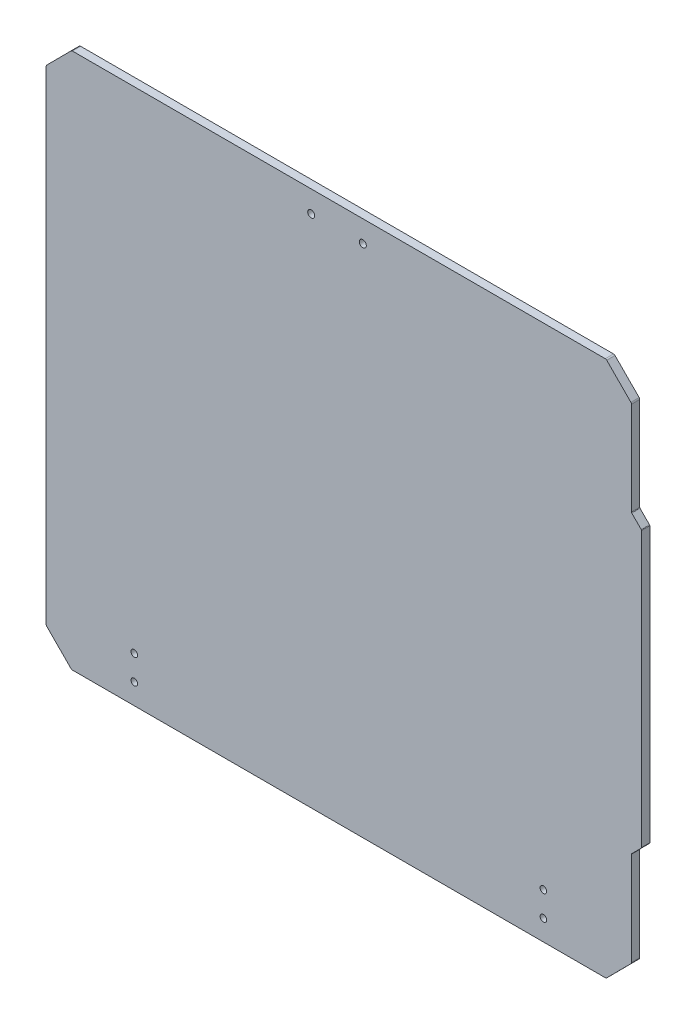
ISO-10303-21;
HEADER;
FILE_DESCRIPTION(('STEP AP214'),'2;1');
FILE_NAME('part.step','',(''),(''),'','','');
FILE_SCHEMA(('AUTOMOTIVE_DESIGN { 1 0 10303 214 1 1 1 1 }'));
ENDSEC;
DATA;
#1=APPLICATION_CONTEXT('core data for automotive mechanical design processes');
#2=APPLICATION_PROTOCOL_DEFINITION('international standard','automotive_design',2000,#1);
#3=PRODUCT_CONTEXT('',#1,'mechanical');
#4=PRODUCT('Part','Part','',(#3));
#5=PRODUCT_RELATED_PRODUCT_CATEGORY('part','',(#4));
#6=PRODUCT_DEFINITION_FORMATION('','',#4);
#7=PRODUCT_DEFINITION_CONTEXT('part definition',#1,'design');
#8=PRODUCT_DEFINITION('design','',#6,#7);
#9=PRODUCT_DEFINITION_SHAPE('','',#8);
#10=(LENGTH_UNIT() NAMED_UNIT(*) SI_UNIT(.MILLI.,.METRE.));
#11=(NAMED_UNIT(*) PLANE_ANGLE_UNIT() SI_UNIT($,.RADIAN.));
#12=(NAMED_UNIT(*) SI_UNIT($,.STERADIAN.) SOLID_ANGLE_UNIT());
#13=UNCERTAINTY_MEASURE_WITH_UNIT(LENGTH_MEASURE(1.E-05),#10,'distance_accuracy_value','');
#14=(GEOMETRIC_REPRESENTATION_CONTEXT(3) GLOBAL_UNCERTAINTY_ASSIGNED_CONTEXT((#13)) GLOBAL_UNIT_ASSIGNED_CONTEXT((#10,
#11,#12)) REPRESENTATION_CONTEXT('',''));
#15=CARTESIAN_POINT('',(0.,0.,0.));
#16=DIRECTION('',(0.,0.,1.));
#17=DIRECTION('',(1.,0.,0.));
#18=AXIS2_PLACEMENT_3D('',#15,#16,#17);
#19=CARTESIAN_POINT('',(752.822366973203,1067.02352140585,4.));
#20=DIRECTION('',(0.,0.,1.));
#21=DIRECTION('',(1.,0.,0.));
#22=AXIS2_PLACEMENT_3D('',#19,#20,#21);
#23=PLANE('',#22);
#24=CARTESIAN_POINT('',(782.822366973204,830.076387405846,4.));
#25=DIRECTION('',(0.,0.,1.));
#26=DIRECTION('',(1.,0.,0.));
#27=AXIS2_PLACEMENT_3D('',#24,#25,#26);
#28=CIRCLE('',#27,1.60000000000005);
#29=CARTESIAN_POINT('',(784.422366973204,830.076387405846,4.));
#30=VERTEX_POINT('',#29);
#31=EDGE_CURVE('E456',#30,#30,#28,.T.);
#32=ORIENTED_EDGE('',*,*,#31,.F.);
#33=EDGE_LOOP('',(#32));
#34=FACE_BOUND('',#33,.T.);
#35=CARTESIAN_POINT('',(782.822366973204,818.076387405847,4.));
#36=DIRECTION('',(0.,0.,1.));
#37=DIRECTION('',(1.,0.,0.));
#38=AXIS2_PLACEMENT_3D('',#35,#36,#37);
#39=CIRCLE('',#38,1.60000000000005);
#40=CARTESIAN_POINT('',(784.422366973204,818.076387405847,4.));
#41=VERTEX_POINT('',#40);
#42=EDGE_CURVE('E468',#41,#41,#39,.T.);
#43=ORIENTED_EDGE('',*,*,#42,.F.);
#44=EDGE_LOOP('',(#43));
#45=FACE_BOUND('',#44,.T.);
#46=CARTESIAN_POINT('',(868.615725973204,1057.52352140585,4.));
#47=DIRECTION('',(0.,0.,1.));
#48=DIRECTION('',(1.,0.,0.));
#49=AXIS2_PLACEMENT_3D('',#46,#47,#48);
#50=CIRCLE('',#49,1.70000000000003);
#51=CARTESIAN_POINT('',(870.315725973204,1057.52352140585,4.));
#52=VERTEX_POINT('',#51);
#53=EDGE_CURVE('E231',#52,#52,#50,.T.);
#54=ORIENTED_EDGE('',*,*,#53,.F.);
#55=EDGE_LOOP('',(#54));
#56=FACE_BOUND('',#55,.T.);
#57=CARTESIAN_POINT('',(752.822366973203,1067.02352140585,4.));
#58=DIRECTION('',(0.,0.,1.));
#59=DIRECTION('',(1.,0.,0.));
#60=AXIS2_PLACEMENT_3D('',#57,#58,#59);
#61=CIRCLE('',#60,1.00000000000008);
#62=CARTESIAN_POINT('',(752.822366973204,1068.02352140585,4.));
#63=VERTEX_POINT('',#62);
#64=CARTESIAN_POINT('',(752.112765999645,1067.72812516565,4.));
#65=VERTEX_POINT('',#64);
#66=EDGE_CURVE('E274',#63,#65,#61,.T.);
#67=ORIENTED_EDGE('',*,*,#66,.T.);
#68=DIRECTION('',(-0.704497063309289,-0.709706902734212,0.));
#69=VECTOR('',#68,1.);
#70=CARTESIAN_POINT('',(752.112765999645,1067.72812516565,4.));
#71=LINE('',#70,#69);
#72=CARTESIAN_POINT('',(740.406125238153,1055.93491240585,4.));
#73=VERTEX_POINT('',#72);
#74=EDGE_CURVE('E142',#65,#73,#71,.T.);
#75=ORIENTED_EDGE('',*,*,#74,.T.);
#76=CARTESIAN_POINT('',(741.115725973203,1055.23030840585,4.));
#77=DIRECTION('',(0.,0.,1.));
#78=DIRECTION('',(1.,0.,0.));
#79=AXIS2_PLACEMENT_3D('',#76,#77,#78);
#80=CIRCLE('',#79,0.999999999999917);
#81=CARTESIAN_POINT('',(740.115725973203,1055.23030840585,4.));
#82=VERTEX_POINT('',#81);
#83=EDGE_CURVE('E337',#73,#82,#80,.T.);
#84=ORIENTED_EDGE('',*,*,#83,.T.);
#85=DIRECTION('',(0.,-1.,0.));
#86=VECTOR('',#85,1.);
#87=CARTESIAN_POINT('',(740.115725973203,820.869600405846,4.));
#88=LINE('',#87,#86);
#89=CARTESIAN_POINT('',(740.115725973203,820.869600405846,4.));
#90=VERTEX_POINT('',#89);
#91=EDGE_CURVE('E356',#82,#90,#88,.T.);
#92=ORIENTED_EDGE('',*,*,#91,.T.);
#93=CARTESIAN_POINT('',(741.115725973204,820.869600405847,4.));
#94=DIRECTION('',(0.,0.,1.));
#95=DIRECTION('',(1.,0.,0.));
#96=AXIS2_PLACEMENT_3D('',#93,#94,#95);
#97=CIRCLE('',#96,1.00000000000009);
#98=CARTESIAN_POINT('',(740.406125008376,820.164996637253,4.));
#99=VERTEX_POINT('',#98);
#100=EDGE_CURVE('E353',#90,#99,#97,.T.);
#101=ORIENTED_EDGE('',*,*,#100,.T.);
#102=DIRECTION('',(0.70449706331145,-0.709706902732067,0.));
#103=VECTOR('',#102,1.);
#104=CARTESIAN_POINT('',(752.112766008377,808.371783637253,4.));
#105=LINE('',#104,#103);
#106=CARTESIAN_POINT('',(752.112766008377,808.371783637253,4.));
#107=VERTEX_POINT('',#106);
#108=EDGE_CURVE('E355',#99,#107,#105,.T.);
#109=ORIENTED_EDGE('',*,*,#108,.T.);
#110=CARTESIAN_POINT('',(752.822366973204,809.076387405847,4.));
#111=DIRECTION('',(0.,0.,1.));
#112=DIRECTION('',(1.,0.,0.));
#113=AXIS2_PLACEMENT_3D('',#110,#111,#112);
#114=CIRCLE('',#113,0.999999999999999);
#115=CARTESIAN_POINT('',(752.822366973204,808.076387405847,4.));
#116=VERTEX_POINT('',#115);
#117=EDGE_CURVE('E358',#107,#116,#114,.T.);
#118=ORIENTED_EDGE('',*,*,#117,.T.);
#119=DIRECTION('',(1.,0.,0.));
#120=VECTOR('',#119,1.);
#121=CARTESIAN_POINT('',(1011.1926579732,808.076387405847,4.));
#122=LINE('',#121,#120);
#123=CARTESIAN_POINT('',(1011.1926579732,808.076387405847,4.));
#124=VERTEX_POINT('',#123);
#125=EDGE_CURVE('E364',#116,#124,#122,.T.);
#126=ORIENTED_EDGE('',*,*,#125,.T.);
#127=CARTESIAN_POINT('',(1011.1926579732,809.076387405847,4.));
#128=DIRECTION('',(0.,0.,1.));
#129=DIRECTION('',(1.,0.,0.));
#130=AXIS2_PLACEMENT_3D('',#127,#128,#129);
#131=CIRCLE('',#130,0.999999999999949);
#132=CARTESIAN_POINT('',(1011.90225894676,808.371783646046,4.));
#133=VERTEX_POINT('',#132);
#134=EDGE_CURVE('E366',#124,#133,#131,.T.);
#135=ORIENTED_EDGE('',*,*,#134,.T.);
#136=DIRECTION('',(0.704497063311391,0.709706902732125,0.));
#137=VECTOR('',#136,1.);
#138=CARTESIAN_POINT('',(1011.90225894676,808.371783646046,4.));
#139=LINE('',#138,#137);
#140=CARTESIAN_POINT('',(1023.60889993803,820.164996637253,4.));
#141=VERTEX_POINT('',#140);
#142=EDGE_CURVE('E368',#133,#141,#139,.T.);
#143=ORIENTED_EDGE('',*,*,#142,.T.);
#144=CARTESIAN_POINT('',(1022.8992989732,820.869600405845,4.));
#145=DIRECTION('',(0.,0.,1.));
#146=DIRECTION('',(1.,0.,0.));
#147=AXIS2_PLACEMENT_3D('',#144,#145,#146);
#148=CIRCLE('',#147,1.00000000000006);
#149=CARTESIAN_POINT('',(1023.8992989732,820.869600405846,4.));
#150=VERTEX_POINT('',#149);
#151=EDGE_CURVE('E370',#141,#150,#148,.T.);
#152=ORIENTED_EDGE('',*,*,#151,.T.);
#153=DIRECTION('',(0.,1.,0.));
#154=VECTOR('',#153,1.);
#155=CARTESIAN_POINT('',(1023.8992989732,820.869600405846,4.));
#156=LINE('',#155,#154);
#157=CARTESIAN_POINT('',(1023.8992989732,866.262456234067,4.));
#158=VERTEX_POINT('',#157);
#159=EDGE_CURVE('E372',#150,#158,#156,.T.);
#160=ORIENTED_EDGE('',*,*,#159,.T.);
#161=CARTESIAN_POINT('',(1024.3992989732,866.262456234066,4.));
#162=DIRECTION('',(0.,0.,-1.));
#163=DIRECTION('',(1.,0.,0.));
#164=AXIS2_PLACEMENT_3D('',#161,#162,#163);
#165=CIRCLE('',#164,0.499999999999942);
#166=CARTESIAN_POINT('',(1024.04574558261,866.61600962466,4.));
#167=VERTEX_POINT('',#166);
#168=EDGE_CURVE('E374',#158,#167,#165,.T.);
#169=ORIENTED_EDGE('',*,*,#168,.T.);
#170=DIRECTION('',(0.707106781186573,0.707106781186522,0.));
#171=VECTOR('',#170,1.);
#172=CARTESIAN_POINT('',(1024.04574558261,866.61600962466,4.));
#173=LINE('',#172,#171);
#174=CARTESIAN_POINT('',(1028.61946580142,871.189729843474,4.));
#175=VERTEX_POINT('',#174);
#176=EDGE_CURVE('E376',#167,#175,#173,.T.);
#177=ORIENTED_EDGE('',*,*,#176,.T.);
#178=CARTESIAN_POINT('',(1028.26591241083,871.543283234066,4.));
#179=DIRECTION('',(0.,0.,1.));
#180=DIRECTION('',(1.,0.,0.));
#181=AXIS2_PLACEMENT_3D('',#178,#179,#180);
#182=CIRCLE('',#181,0.499999999999942);
#183=CARTESIAN_POINT('',(1028.76591241083,871.543283234067,4.));
#184=VERTEX_POINT('',#183);
#185=EDGE_CURVE('E378',#175,#184,#182,.T.);
#186=ORIENTED_EDGE('',*,*,#185,.T.);
#187=DIRECTION('',(0.,1.,0.));
#188=VECTOR('',#187,1.);
#189=CARTESIAN_POINT('',(1028.76591241083,871.543283234067,4.));
#190=LINE('',#189,#188);
#191=CARTESIAN_POINT('',(1028.76591241083,1004.66460357763,4.));
#192=VERTEX_POINT('',#191);
#193=EDGE_CURVE('E380',#184,#192,#190,.T.);
#194=ORIENTED_EDGE('',*,*,#193,.T.);
#195=CARTESIAN_POINT('',(1028.26591241083,1004.66460357763,4.));
#196=DIRECTION('',(0.,0.,1.));
#197=DIRECTION('',(1.,0.,0.));
#198=AXIS2_PLACEMENT_3D('',#195,#196,#197);
#199=CIRCLE('',#198,0.499999999999981);
#200=CARTESIAN_POINT('',(1028.61946580142,1005.01815696822,4.));
#201=VERTEX_POINT('',#200);
#202=EDGE_CURVE('E382',#192,#201,#199,.T.);
#203=ORIENTED_EDGE('',*,*,#202,.T.);
#204=DIRECTION('',(-0.707106781186565,0.70710678118653,0.));
#205=VECTOR('',#204,1.);
#206=CARTESIAN_POINT('',(1024.04574558261,1009.59187718703,4.));
#207=LINE('',#206,#205);
#208=CARTESIAN_POINT('',(1024.04574558261,1009.59187718703,4.));
#209=VERTEX_POINT('',#208);
#210=EDGE_CURVE('E384',#201,#209,#207,.T.);
#211=ORIENTED_EDGE('',*,*,#210,.T.);
#212=CARTESIAN_POINT('',(1024.3992989732,1009.94543057763,4.));
#213=DIRECTION('',(0.,0.,-1.));
#214=DIRECTION('',(1.,0.,0.));
#215=AXIS2_PLACEMENT_3D('',#212,#213,#214);
#216=CIRCLE('',#215,0.499999999999903);
#217=CARTESIAN_POINT('',(1023.8992989732,1009.94543057763,4.));
#218=VERTEX_POINT('',#217);
#219=EDGE_CURVE('E386',#209,#218,#216,.T.);
#220=ORIENTED_EDGE('',*,*,#219,.T.);
#221=DIRECTION('',(0.,1.,0.));
#222=VECTOR('',#221,1.);
#223=CARTESIAN_POINT('',(1023.8992989732,1009.94543057763,4.));
#224=LINE('',#223,#222);
#225=CARTESIAN_POINT('',(1023.8992989732,1055.23030740585,4.));
#226=VERTEX_POINT('',#225);
#227=EDGE_CURVE('E388',#218,#226,#224,.T.);
#228=ORIENTED_EDGE('',*,*,#227,.T.);
#229=CARTESIAN_POINT('',(1022.8992989732,1055.23030740585,4.));
#230=DIRECTION('',(0.,0.,1.));
#231=DIRECTION('',(1.,0.,0.));
#232=AXIS2_PLACEMENT_3D('',#229,#230,#231);
#233=CIRCLE('',#232,1.0000000000001);
#234=CARTESIAN_POINT('',(1023.60889993803,1055.93491117444,4.));
#235=VERTEX_POINT('',#234);
#236=EDGE_CURVE('E209',#226,#235,#233,.T.);
#237=ORIENTED_EDGE('',*,*,#236,.T.);
#238=DIRECTION('',(-0.704497063533912,0.709706902511238,0.));
#239=VECTOR('',#238,1.);
#240=CARTESIAN_POINT('',(1011.90225794676,1067.72812516565,4.));
#241=LINE('',#240,#239);
#242=CARTESIAN_POINT('',(1011.90225794676,1067.72812516565,4.));
#243=VERTEX_POINT('',#242);
#244=EDGE_CURVE('E203',#235,#243,#241,.T.);
#245=ORIENTED_EDGE('',*,*,#244,.T.);
#246=CARTESIAN_POINT('',(1011.1926569732,1067.02352140585,4.));
#247=DIRECTION('',(0.,0.,1.));
#248=DIRECTION('',(1.,0.,0.));
#249=AXIS2_PLACEMENT_3D('',#246,#247,#248);
#250=CIRCLE('',#249,0.999999999999894);
#251=CARTESIAN_POINT('',(1011.1926569732,1068.02352140585,4.));
#252=VERTEX_POINT('',#251);
#253=EDGE_CURVE('E207',#243,#252,#250,.T.);
#254=ORIENTED_EDGE('',*,*,#253,.T.);
#255=DIRECTION('',(-1.,0.,0.));
#256=VECTOR('',#255,1.);
#257=CARTESIAN_POINT('',(1011.1926569732,1068.02352140585,4.));
#258=LINE('',#257,#256);
#259=EDGE_CURVE('E51',#252,#63,#258,.T.);
#260=ORIENTED_EDGE('',*,*,#259,.T.);
#261=EDGE_LOOP('',(#67,#75,#84,#92,#101,#109,#118,#126,#135,#143,#152,#160,#169,#177,#186,#194,
#203,#211,#220,#228,#237,#245,#254,#260));
#262=FACE_BOUND('',#261,.T.);
#263=CARTESIAN_POINT('',(893.615725973204,1057.52352140585,4.));
#264=DIRECTION('',(0.,0.,1.));
#265=DIRECTION('',(1.,0.,0.));
#266=AXIS2_PLACEMENT_3D('',#263,#264,#265);
#267=CIRCLE('',#266,1.70000000000003);
#268=CARTESIAN_POINT('',(895.315725973204,1057.52352140585,4.));
#269=VERTEX_POINT('',#268);
#270=EDGE_CURVE('E474',#269,#269,#267,.T.);
#271=ORIENTED_EDGE('',*,*,#270,.F.);
#272=EDGE_LOOP('',(#271));
#273=FACE_BOUND('',#272,.T.);
#274=CARTESIAN_POINT('',(981.192657973203,818.076387405847,4.));
#275=DIRECTION('',(0.,0.,1.));
#276=DIRECTION('',(1.,0.,0.));
#277=AXIS2_PLACEMENT_3D('',#274,#275,#276);
#278=CIRCLE('',#277,1.60000000000005);
#279=CARTESIAN_POINT('',(982.792657973203,818.076387405847,4.));
#280=VERTEX_POINT('',#279);
#281=EDGE_CURVE('E462',#280,#280,#278,.T.);
#282=ORIENTED_EDGE('',*,*,#281,.F.);
#283=EDGE_LOOP('',(#282));
#284=FACE_BOUND('',#283,.T.);
#285=CARTESIAN_POINT('',(981.192657973203,830.076387405846,4.));
#286=DIRECTION('',(0.,0.,1.));
#287=DIRECTION('',(1.,0.,0.));
#288=AXIS2_PLACEMENT_3D('',#285,#286,#287);
#289=CIRCLE('',#288,1.60000000000005);
#290=CARTESIAN_POINT('',(982.792657973203,830.076387405846,4.));
#291=VERTEX_POINT('',#290);
#292=EDGE_CURVE('E447',#291,#291,#289,.T.);
#293=ORIENTED_EDGE('',*,*,#292,.F.);
#294=EDGE_LOOP('',(#293));
#295=FACE_BOUND('',#294,.T.);
#296=ADVANCED_FACE('F34',(#34,#45,#56,#262,#273,#284,#295),#23,.T.);
#297=CARTESIAN_POINT('',(752.822366973203,1067.02352140585,0.));
#298=DIRECTION('',(0.,0.,1.));
#299=DIRECTION('',(1.,0.,0.));
#300=AXIS2_PLACEMENT_3D('',#297,#298,#299);
#301=PLANE('',#300);
#302=CARTESIAN_POINT('',(752.822366973203,1067.02352140585,0.));
#303=DIRECTION('',(0.,0.,1.));
#304=DIRECTION('',(1.,0.,0.));
#305=AXIS2_PLACEMENT_3D('',#302,#303,#304);
#306=CIRCLE('',#305,1.00000000000008);
#307=CARTESIAN_POINT('',(752.822366973204,1068.02352140585,0.));
#308=VERTEX_POINT('',#307);
#309=CARTESIAN_POINT('',(752.112765999645,1067.72812516565,0.));
#310=VERTEX_POINT('',#309);
#311=EDGE_CURVE('E227',#308,#310,#306,.T.);
#312=ORIENTED_EDGE('',*,*,#311,.F.);
#313=DIRECTION('',(-1.,0.,0.));
#314=VECTOR('',#313,1.);
#315=CARTESIAN_POINT('',(1011.1926569732,1068.02352140585,0.));
#316=LINE('',#315,#314);
#317=CARTESIAN_POINT('',(1011.1926569732,1068.02352140585,0.));
#318=VERTEX_POINT('',#317);
#319=EDGE_CURVE('E134',#318,#308,#316,.T.);
#320=ORIENTED_EDGE('',*,*,#319,.F.);
#321=CARTESIAN_POINT('',(1011.1926569732,1067.02352140585,0.));
#322=DIRECTION('',(0.,0.,1.));
#323=DIRECTION('',(1.,0.,0.));
#324=AXIS2_PLACEMENT_3D('',#321,#322,#323);
#325=CIRCLE('',#324,0.999999999999894);
#326=CARTESIAN_POINT('',(1011.90225794676,1067.72812516565,0.));
#327=VERTEX_POINT('',#326);
#328=EDGE_CURVE('E128',#327,#318,#325,.T.);
#329=ORIENTED_EDGE('',*,*,#328,.F.);
#330=DIRECTION('',(-0.704497063533912,0.709706902511238,0.));
#331=VECTOR('',#330,1.);
#332=CARTESIAN_POINT('',(1011.90225794676,1067.72812516565,0.));
#333=LINE('',#332,#331);
#334=CARTESIAN_POINT('',(1023.60889993803,1055.93491117444,0.));
#335=VERTEX_POINT('',#334);
#336=EDGE_CURVE('E217',#335,#327,#333,.T.);
#337=ORIENTED_EDGE('',*,*,#336,.F.);
#338=CARTESIAN_POINT('',(1022.8992989732,1055.23030740585,0.));
#339=DIRECTION('',(0.,0.,1.));
#340=DIRECTION('',(1.,0.,0.));
#341=AXIS2_PLACEMENT_3D('',#338,#339,#340);
#342=CIRCLE('',#341,1.0000000000001);
#343=CARTESIAN_POINT('',(1023.8992989732,1055.23030740585,0.));
#344=VERTEX_POINT('',#343);
#345=EDGE_CURVE('E269',#344,#335,#342,.T.);
#346=ORIENTED_EDGE('',*,*,#345,.F.);
#347=DIRECTION('',(0.,1.,0.));
#348=VECTOR('',#347,1.);
#349=CARTESIAN_POINT('',(1023.8992989732,1009.94543057763,0.));
#350=LINE('',#349,#348);
#351=CARTESIAN_POINT('',(1023.8992989732,1009.94543057763,0.));
#352=VERTEX_POINT('',#351);
#353=EDGE_CURVE('E267',#352,#344,#350,.T.);
#354=ORIENTED_EDGE('',*,*,#353,.F.);
#355=CARTESIAN_POINT('',(1024.3992989732,1009.94543057763,0.));
#356=DIRECTION('',(0.,0.,-1.));
#357=DIRECTION('',(1.,0.,0.));
#358=AXIS2_PLACEMENT_3D('',#355,#356,#357);
#359=CIRCLE('',#358,0.499999999999903);
#360=CARTESIAN_POINT('',(1024.04574558261,1009.59187718703,0.));
#361=VERTEX_POINT('',#360);
#362=EDGE_CURVE('E265',#361,#352,#359,.T.);
#363=ORIENTED_EDGE('',*,*,#362,.F.);
#364=DIRECTION('',(-0.707106781186565,0.70710678118653,0.));
#365=VECTOR('',#364,1.);
#366=CARTESIAN_POINT('',(1024.04574558261,1009.59187718703,0.));
#367=LINE('',#366,#365);
#368=CARTESIAN_POINT('',(1028.61946580142,1005.01815696822,0.));
#369=VERTEX_POINT('',#368);
#370=EDGE_CURVE('E263',#369,#361,#367,.T.);
#371=ORIENTED_EDGE('',*,*,#370,.F.);
#372=CARTESIAN_POINT('',(1028.26591241083,1004.66460357763,0.));
#373=DIRECTION('',(0.,0.,1.));
#374=DIRECTION('',(1.,0.,0.));
#375=AXIS2_PLACEMENT_3D('',#372,#373,#374);
#376=CIRCLE('',#375,0.499999999999981);
#377=CARTESIAN_POINT('',(1028.76591241083,1004.66460357763,0.));
#378=VERTEX_POINT('',#377);
#379=EDGE_CURVE('E261',#378,#369,#376,.T.);
#380=ORIENTED_EDGE('',*,*,#379,.F.);
#381=DIRECTION('',(0.,1.,0.));
#382=VECTOR('',#381,1.);
#383=CARTESIAN_POINT('',(1028.76591241083,871.543283234067,0.));
#384=LINE('',#383,#382);
#385=CARTESIAN_POINT('',(1028.76591241083,871.543283234067,0.));
#386=VERTEX_POINT('',#385);
#387=EDGE_CURVE('E259',#386,#378,#384,.T.);
#388=ORIENTED_EDGE('',*,*,#387,.F.);
#389=CARTESIAN_POINT('',(1028.26591241083,871.543283234066,0.));
#390=DIRECTION('',(0.,0.,1.));
#391=DIRECTION('',(1.,0.,0.));
#392=AXIS2_PLACEMENT_3D('',#389,#390,#391);
#393=CIRCLE('',#392,0.499999999999942);
#394=CARTESIAN_POINT('',(1028.61946580142,871.189729843474,0.));
#395=VERTEX_POINT('',#394);
#396=EDGE_CURVE('E257',#395,#386,#393,.T.);
#397=ORIENTED_EDGE('',*,*,#396,.F.);
#398=DIRECTION('',(0.707106781186573,0.707106781186522,0.));
#399=VECTOR('',#398,1.);
#400=CARTESIAN_POINT('',(1024.04574558261,866.61600962466,0.));
#401=LINE('',#400,#399);
#402=CARTESIAN_POINT('',(1024.04574558261,866.61600962466,0.));
#403=VERTEX_POINT('',#402);
#404=EDGE_CURVE('E255',#403,#395,#401,.T.);
#405=ORIENTED_EDGE('',*,*,#404,.F.);
#406=CARTESIAN_POINT('',(1024.3992989732,866.262456234066,0.));
#407=DIRECTION('',(0.,0.,-1.));
#408=DIRECTION('',(1.,0.,0.));
#409=AXIS2_PLACEMENT_3D('',#406,#407,#408);
#410=CIRCLE('',#409,0.499999999999942);
#411=CARTESIAN_POINT('',(1023.8992989732,866.262456234067,0.));
#412=VERTEX_POINT('',#411);
#413=EDGE_CURVE('E253',#412,#403,#410,.T.);
#414=ORIENTED_EDGE('',*,*,#413,.F.);
#415=DIRECTION('',(0.,1.,0.));
#416=VECTOR('',#415,1.);
#417=CARTESIAN_POINT('',(1023.8992989732,820.869600405846,0.));
#418=LINE('',#417,#416);
#419=CARTESIAN_POINT('',(1023.8992989732,820.869600405846,0.));
#420=VERTEX_POINT('',#419);
#421=EDGE_CURVE('E251',#420,#412,#418,.T.);
#422=ORIENTED_EDGE('',*,*,#421,.F.);
#423=CARTESIAN_POINT('',(1022.8992989732,820.869600405845,0.));
#424=DIRECTION('',(0.,0.,1.));
#425=DIRECTION('',(1.,0.,0.));
#426=AXIS2_PLACEMENT_3D('',#423,#424,#425);
#427=CIRCLE('',#426,1.00000000000006);
#428=CARTESIAN_POINT('',(1023.60889993803,820.164996637253,0.));
#429=VERTEX_POINT('',#428);
#430=EDGE_CURVE('E249',#429,#420,#427,.T.);
#431=ORIENTED_EDGE('',*,*,#430,.F.);
#432=DIRECTION('',(0.704497063311391,0.709706902732125,0.));
#433=VECTOR('',#432,1.);
#434=CARTESIAN_POINT('',(1011.90225894676,808.371783646046,0.));
#435=LINE('',#434,#433);
#436=CARTESIAN_POINT('',(1011.90225894676,808.371783646046,0.));
#437=VERTEX_POINT('',#436);
#438=EDGE_CURVE('E247',#437,#429,#435,.T.);
#439=ORIENTED_EDGE('',*,*,#438,.F.);
#440=CARTESIAN_POINT('',(1011.1926579732,809.076387405847,0.));
#441=DIRECTION('',(0.,0.,1.));
#442=DIRECTION('',(1.,0.,0.));
#443=AXIS2_PLACEMENT_3D('',#440,#441,#442);
#444=CIRCLE('',#443,0.999999999999949);
#445=CARTESIAN_POINT('',(1011.1926579732,808.076387405847,0.));
#446=VERTEX_POINT('',#445);
#447=EDGE_CURVE('E245',#446,#437,#444,.T.);
#448=ORIENTED_EDGE('',*,*,#447,.F.);
#449=DIRECTION('',(1.,0.,0.));
#450=VECTOR('',#449,1.);
#451=CARTESIAN_POINT('',(1011.1926579732,808.076387405847,0.));
#452=LINE('',#451,#450);
#453=CARTESIAN_POINT('',(752.822366973204,808.076387405847,0.));
#454=VERTEX_POINT('',#453);
#455=EDGE_CURVE('E243',#454,#446,#452,.T.);
#456=ORIENTED_EDGE('',*,*,#455,.F.);
#457=CARTESIAN_POINT('',(752.822366973204,809.076387405847,0.));
#458=DIRECTION('',(0.,0.,1.));
#459=DIRECTION('',(1.,0.,0.));
#460=AXIS2_PLACEMENT_3D('',#457,#458,#459);
#461=CIRCLE('',#460,0.999999999999999);
#462=CARTESIAN_POINT('',(752.112766008377,808.371783637253,0.));
#463=VERTEX_POINT('',#462);
#464=EDGE_CURVE('E241',#463,#454,#461,.T.);
#465=ORIENTED_EDGE('',*,*,#464,.F.);
#466=DIRECTION('',(0.70449706331145,-0.709706902732067,0.));
#467=VECTOR('',#466,1.);
#468=CARTESIAN_POINT('',(752.112766008377,808.371783637253,0.));
#469=LINE('',#468,#467);
#470=CARTESIAN_POINT('',(740.406125008376,820.164996637253,0.));
#471=VERTEX_POINT('',#470);
#472=EDGE_CURVE('E239',#471,#463,#469,.T.);
#473=ORIENTED_EDGE('',*,*,#472,.F.);
#474=CARTESIAN_POINT('',(741.115725973204,820.869600405847,0.));
#475=DIRECTION('',(0.,0.,1.));
#476=DIRECTION('',(1.,0.,0.));
#477=AXIS2_PLACEMENT_3D('',#474,#475,#476);
#478=CIRCLE('',#477,1.00000000000009);
#479=CARTESIAN_POINT('',(740.115725973203,820.869600405846,0.));
#480=VERTEX_POINT('',#479);
#481=EDGE_CURVE('E237',#480,#471,#478,.T.);
#482=ORIENTED_EDGE('',*,*,#481,.F.);
#483=DIRECTION('',(0.,-1.,0.));
#484=VECTOR('',#483,1.);
#485=CARTESIAN_POINT('',(740.115725973203,820.869600405846,0.));
#486=LINE('',#485,#484);
#487=CARTESIAN_POINT('',(740.115725973203,1055.23030840585,0.));
#488=VERTEX_POINT('',#487);
#489=EDGE_CURVE('E235',#488,#480,#486,.T.);
#490=ORIENTED_EDGE('',*,*,#489,.F.);
#491=CARTESIAN_POINT('',(741.115725973203,1055.23030840585,0.));
#492=DIRECTION('',(0.,0.,1.));
#493=DIRECTION('',(1.,0.,0.));
#494=AXIS2_PLACEMENT_3D('',#491,#492,#493);
#495=CIRCLE('',#494,0.999999999999917);
#496=CARTESIAN_POINT('',(740.406125238153,1055.93491240585,0.));
#497=VERTEX_POINT('',#496);
#498=EDGE_CURVE('E233',#497,#488,#495,.T.);
#499=ORIENTED_EDGE('',*,*,#498,.F.);
#500=DIRECTION('',(-0.704497063309289,-0.709706902734212,0.));
#501=VECTOR('',#500,1.);
#502=CARTESIAN_POINT('',(752.112765999645,1067.72812516565,0.));
#503=LINE('',#502,#501);
#504=EDGE_CURVE('E230',#310,#497,#503,.T.);
#505=ORIENTED_EDGE('',*,*,#504,.F.);
#506=EDGE_LOOP('',(#312,#320,#329,#337,#346,#354,#363,#371,#380,#388,#397,#405,#414,#422,#431,
#439,#448,#456,#465,#473,#482,#490,#499,#505));
#507=FACE_BOUND('',#506,.T.);
#508=CARTESIAN_POINT('',(868.615725973204,1057.52352140585,0.));
#509=DIRECTION('',(0.,0.,1.));
#510=DIRECTION('',(1.,0.,0.));
#511=AXIS2_PLACEMENT_3D('',#508,#509,#510);
#512=CIRCLE('',#511,1.70000000000003);
#513=CARTESIAN_POINT('',(870.315725973204,1057.52352140585,0.));
#514=VERTEX_POINT('',#513);
#515=EDGE_CURVE('E477',#514,#514,#512,.T.);
#516=ORIENTED_EDGE('',*,*,#515,.T.);
#517=EDGE_LOOP('',(#516));
#518=FACE_BOUND('',#517,.T.);
#519=CARTESIAN_POINT('',(893.615725973204,1057.52352140585,0.));
#520=DIRECTION('',(0.,0.,1.));
#521=DIRECTION('',(1.,0.,0.));
#522=AXIS2_PLACEMENT_3D('',#519,#520,#521);
#523=CIRCLE('',#522,1.70000000000003);
#524=CARTESIAN_POINT('',(895.315725973204,1057.52352140585,0.));
#525=VERTEX_POINT('',#524);
#526=EDGE_CURVE('E471',#525,#525,#523,.T.);
#527=ORIENTED_EDGE('',*,*,#526,.T.);
#528=EDGE_LOOP('',(#527));
#529=FACE_BOUND('',#528,.T.);
#530=CARTESIAN_POINT('',(782.822366973204,818.076387405847,0.));
#531=DIRECTION('',(0.,0.,1.));
#532=DIRECTION('',(1.,0.,0.));
#533=AXIS2_PLACEMENT_3D('',#530,#531,#532);
#534=CIRCLE('',#533,1.60000000000005);
#535=CARTESIAN_POINT('',(784.422366973204,818.076387405847,0.));
#536=VERTEX_POINT('',#535);
#537=EDGE_CURVE('E465',#536,#536,#534,.T.);
#538=ORIENTED_EDGE('',*,*,#537,.T.);
#539=EDGE_LOOP('',(#538));
#540=FACE_BOUND('',#539,.T.);
#541=CARTESIAN_POINT('',(981.192657973203,818.076387405847,0.));
#542=DIRECTION('',(0.,0.,1.));
#543=DIRECTION('',(1.,0.,0.));
#544=AXIS2_PLACEMENT_3D('',#541,#542,#543);
#545=CIRCLE('',#544,1.60000000000005);
#546=CARTESIAN_POINT('',(982.792657973203,818.076387405847,0.));
#547=VERTEX_POINT('',#546);
#548=EDGE_CURVE('E459',#547,#547,#545,.T.);
#549=ORIENTED_EDGE('',*,*,#548,.T.);
#550=EDGE_LOOP('',(#549));
#551=FACE_BOUND('',#550,.T.);
#552=CARTESIAN_POINT('',(782.822366973204,830.076387405846,0.));
#553=DIRECTION('',(0.,0.,1.));
#554=DIRECTION('',(1.,0.,0.));
#555=AXIS2_PLACEMENT_3D('',#552,#553,#554);
#556=CIRCLE('',#555,1.60000000000005);
#557=CARTESIAN_POINT('',(784.422366973204,830.076387405846,0.));
#558=VERTEX_POINT('',#557);
#559=EDGE_CURVE('E453',#558,#558,#556,.T.);
#560=ORIENTED_EDGE('',*,*,#559,.T.);
#561=EDGE_LOOP('',(#560));
#562=FACE_BOUND('',#561,.T.);
#563=CARTESIAN_POINT('',(981.192657973203,830.076387405846,0.));
#564=DIRECTION('',(0.,0.,1.));
#565=DIRECTION('',(1.,0.,0.));
#566=AXIS2_PLACEMENT_3D('',#563,#564,#565);
#567=CIRCLE('',#566,1.60000000000005);
#568=CARTESIAN_POINT('',(982.792657973203,830.076387405846,0.));
#569=VERTEX_POINT('',#568);
#570=EDGE_CURVE('E450',#569,#569,#567,.T.);
#571=ORIENTED_EDGE('',*,*,#570,.T.);
#572=EDGE_LOOP('',(#571));
#573=FACE_BOUND('',#572,.T.);
#574=ADVANCED_FACE('F341',(#507,#518,#529,#540,#551,#562,#573),#301,.F.);
#575=CARTESIAN_POINT('',(752.822366973203,1067.02352140585,4.));
#576=DIRECTION('',(0.,0.,-1.));
#577=DIRECTION('',(-1.,0.,0.));
#578=AXIS2_PLACEMENT_3D('',#575,#576,#577);
#579=CYLINDRICAL_SURFACE('',#578,1.00000000000008);
#580=ORIENTED_EDGE('',*,*,#311,.T.);
#581=DIRECTION('',(0.,0.,-1.));
#582=VECTOR('',#581,1.);
#583=CARTESIAN_POINT('',(752.112765999645,1067.72812516565,4.));
#584=LINE('',#583,#582);
#585=EDGE_CURVE('E11',#65,#310,#584,.T.);
#586=ORIENTED_EDGE('',*,*,#585,.F.);
#587=ORIENTED_EDGE('',*,*,#66,.F.);
#588=DIRECTION('',(0.,0.,-1.));
#589=VECTOR('',#588,1.);
#590=CARTESIAN_POINT('',(752.822366973204,1068.02352140585,4.));
#591=LINE('',#590,#589);
#592=EDGE_CURVE('E223',#63,#308,#591,.T.);
#593=ORIENTED_EDGE('',*,*,#592,.T.);
#594=EDGE_LOOP('',(#580,#586,#587,#593));
#595=FACE_BOUND('',#594,.T.);
#596=ADVANCED_FACE('F36',(#595),#579,.T.);
#597=CARTESIAN_POINT('',(752.112765999645,1067.72812516565,4.));
#598=DIRECTION('',(0.709706902734212,-0.704497063309289,0.));
#599=DIRECTION('',(0.704497063309289,0.709706902734212,0.));
#600=AXIS2_PLACEMENT_3D('',#597,#598,#599);
#601=PLANE('',#600);
#602=ORIENTED_EDGE('',*,*,#504,.T.);
#603=DIRECTION('',(0.,0.,-1.));
#604=VECTOR('',#603,1.);
#605=CARTESIAN_POINT('',(740.406125238153,1055.93491240585,4.));
#606=LINE('',#605,#604);
#607=EDGE_CURVE('E43',#73,#497,#606,.T.);
#608=ORIENTED_EDGE('',*,*,#607,.F.);
#609=ORIENTED_EDGE('',*,*,#74,.F.);
#610=ORIENTED_EDGE('',*,*,#585,.T.);
#611=EDGE_LOOP('',(#602,#608,#609,#610));
#612=FACE_BOUND('',#611,.T.);
#613=ADVANCED_FACE('F732',(#612),#601,.F.);
#614=CARTESIAN_POINT('',(741.115725973203,1055.23030840585,4.));
#615=DIRECTION('',(0.,0.,-1.));
#616=DIRECTION('',(-1.,0.,0.));
#617=AXIS2_PLACEMENT_3D('',#614,#615,#616);
#618=CYLINDRICAL_SURFACE('',#617,0.999999999999917);
#619=ORIENTED_EDGE('',*,*,#498,.T.);
#620=DIRECTION('',(0.,0.,-1.));
#621=VECTOR('',#620,1.);
#622=CARTESIAN_POINT('',(740.115725973203,1055.23030840585,4.));
#623=LINE('',#622,#621);
#624=EDGE_CURVE('E329',#82,#488,#623,.T.);
#625=ORIENTED_EDGE('',*,*,#624,.F.);
#626=ORIENTED_EDGE('',*,*,#83,.F.);
#627=ORIENTED_EDGE('',*,*,#607,.T.);
#628=EDGE_LOOP('',(#619,#625,#626,#627));
#629=FACE_BOUND('',#628,.T.);
#630=ADVANCED_FACE('F335',(#629),#618,.T.);
#631=CARTESIAN_POINT('',(740.115725973203,820.869600405846,4.));
#632=DIRECTION('',(1.,0.,0.));
#633=DIRECTION('',(0.,0.,-1.));
#634=AXIS2_PLACEMENT_3D('',#631,#632,#633);
#635=PLANE('',#634);
#636=ORIENTED_EDGE('',*,*,#489,.T.);
#637=DIRECTION('',(0.,0.,-1.));
#638=VECTOR('',#637,1.);
#639=CARTESIAN_POINT('',(740.115725973203,820.869600405846,4.));
#640=LINE('',#639,#638);
#641=EDGE_CURVE('E326',#90,#480,#640,.T.);
#642=ORIENTED_EDGE('',*,*,#641,.F.);
#643=ORIENTED_EDGE('',*,*,#91,.F.);
#644=ORIENTED_EDGE('',*,*,#624,.T.);
#645=EDGE_LOOP('',(#636,#642,#643,#644));
#646=FACE_BOUND('',#645,.T.);
#647=ADVANCED_FACE('F347',(#646),#635,.F.);
#648=CARTESIAN_POINT('',(741.115725973204,820.869600405847,4.));
#649=DIRECTION('',(0.,0.,-1.));
#650=DIRECTION('',(-1.,0.,0.));
#651=AXIS2_PLACEMENT_3D('',#648,#649,#650);
#652=CYLINDRICAL_SURFACE('',#651,1.00000000000009);
#653=ORIENTED_EDGE('',*,*,#481,.T.);
#654=DIRECTION('',(0.,0.,-1.));
#655=VECTOR('',#654,1.);
#656=CARTESIAN_POINT('',(740.406125008376,820.164996637253,4.));
#657=LINE('',#656,#655);
#658=EDGE_CURVE('E323',#99,#471,#657,.T.);
#659=ORIENTED_EDGE('',*,*,#658,.F.);
#660=ORIENTED_EDGE('',*,*,#100,.F.);
#661=ORIENTED_EDGE('',*,*,#641,.T.);
#662=EDGE_LOOP('',(#653,#659,#660,#661));
#663=FACE_BOUND('',#662,.T.);
#664=ADVANCED_FACE('F351',(#663),#652,.T.);
#665=CARTESIAN_POINT('',(752.112766008377,808.371783637253,4.));
#666=DIRECTION('',(0.709706902732067,0.70449706331145,0.));
#667=DIRECTION('',(-0.70449706331145,0.709706902732067,0.));
#668=AXIS2_PLACEMENT_3D('',#665,#666,#667);
#669=PLANE('',#668);
#670=ORIENTED_EDGE('',*,*,#472,.T.);
#671=DIRECTION('',(0.,0.,-1.));
#672=VECTOR('',#671,1.);
#673=CARTESIAN_POINT('',(752.112766008377,808.371783637253,4.));
#674=LINE('',#673,#672);
#675=EDGE_CURVE('E320',#107,#463,#674,.T.);
#676=ORIENTED_EDGE('',*,*,#675,.F.);
#677=ORIENTED_EDGE('',*,*,#108,.F.);
#678=ORIENTED_EDGE('',*,*,#658,.T.);
#679=EDGE_LOOP('',(#670,#676,#677,#678));
#680=FACE_BOUND('',#679,.T.);
#681=ADVANCED_FACE('F697',(#680),#669,.F.);
#682=CARTESIAN_POINT('',(752.822366973204,809.076387405847,4.));
#683=DIRECTION('',(0.,0.,-1.));
#684=DIRECTION('',(-1.,0.,0.));
#685=AXIS2_PLACEMENT_3D('',#682,#683,#684);
#686=CYLINDRICAL_SURFACE('',#685,0.999999999999999);
#687=ORIENTED_EDGE('',*,*,#464,.T.);
#688=DIRECTION('',(0.,0.,-1.));
#689=VECTOR('',#688,1.);
#690=CARTESIAN_POINT('',(752.822366973204,808.076387405847,4.));
#691=LINE('',#690,#689);
#692=EDGE_CURVE('E317',#116,#454,#691,.T.);
#693=ORIENTED_EDGE('',*,*,#692,.F.);
#694=ORIENTED_EDGE('',*,*,#117,.F.);
#695=ORIENTED_EDGE('',*,*,#675,.T.);
#696=EDGE_LOOP('',(#687,#693,#694,#695));
#697=FACE_BOUND('',#696,.T.);
#698=ADVANCED_FACE('F687',(#697),#686,.T.);
#699=CARTESIAN_POINT('',(1011.1926579732,808.076387405847,4.));
#700=DIRECTION('',(0.,1.,0.));
#701=DIRECTION('',(0.,0.,1.));
#702=AXIS2_PLACEMENT_3D('',#699,#700,#701);
#703=PLANE('',#702);
#704=ORIENTED_EDGE('',*,*,#455,.T.);
#705=DIRECTION('',(0.,0.,-1.));
#706=VECTOR('',#705,1.);
#707=CARTESIAN_POINT('',(1011.1926579732,808.076387405847,4.));
#708=LINE('',#707,#706);
#709=EDGE_CURVE('E314',#124,#446,#708,.T.);
#710=ORIENTED_EDGE('',*,*,#709,.F.);
#711=ORIENTED_EDGE('',*,*,#125,.F.);
#712=ORIENTED_EDGE('',*,*,#692,.T.);
#713=EDGE_LOOP('',(#704,#710,#711,#712));
#714=FACE_BOUND('',#713,.T.);
#715=ADVANCED_FACE('F677',(#714),#703,.F.);
#716=CARTESIAN_POINT('',(1011.1926579732,809.076387405847,4.));
#717=DIRECTION('',(0.,0.,-1.));
#718=DIRECTION('',(-1.,0.,0.));
#719=AXIS2_PLACEMENT_3D('',#716,#717,#718);
#720=CYLINDRICAL_SURFACE('',#719,0.999999999999949);
#721=ORIENTED_EDGE('',*,*,#447,.T.);
#722=DIRECTION('',(0.,0.,-1.));
#723=VECTOR('',#722,1.);
#724=CARTESIAN_POINT('',(1011.90225894676,808.371783646046,4.));
#725=LINE('',#724,#723);
#726=EDGE_CURVE('E311',#133,#437,#725,.T.);
#727=ORIENTED_EDGE('',*,*,#726,.F.);
#728=ORIENTED_EDGE('',*,*,#134,.F.);
#729=ORIENTED_EDGE('',*,*,#709,.T.);
#730=EDGE_LOOP('',(#721,#727,#728,#729));
#731=FACE_BOUND('',#730,.T.);
#732=ADVANCED_FACE('F667',(#731),#720,.T.);
#733=CARTESIAN_POINT('',(1011.90225894676,808.371783646046,4.));
#734=DIRECTION('',(-0.709706902732125,0.704497063311391,0.));
#735=DIRECTION('',(-0.704497063311391,-0.709706902732125,0.));
#736=AXIS2_PLACEMENT_3D('',#733,#734,#735);
#737=PLANE('',#736);
#738=ORIENTED_EDGE('',*,*,#438,.T.);
#739=DIRECTION('',(0.,0.,-1.));
#740=VECTOR('',#739,1.);
#741=CARTESIAN_POINT('',(1023.60889993803,820.164996637253,4.));
#742=LINE('',#741,#740);
#743=EDGE_CURVE('E308',#141,#429,#742,.T.);
#744=ORIENTED_EDGE('',*,*,#743,.F.);
#745=ORIENTED_EDGE('',*,*,#142,.F.);
#746=ORIENTED_EDGE('',*,*,#726,.T.);
#747=EDGE_LOOP('',(#738,#744,#745,#746));
#748=FACE_BOUND('',#747,.T.);
#749=ADVANCED_FACE('F657',(#748),#737,.F.);
#750=CARTESIAN_POINT('',(1022.8992989732,820.869600405845,4.));
#751=DIRECTION('',(0.,0.,-1.));
#752=DIRECTION('',(-1.,0.,0.));
#753=AXIS2_PLACEMENT_3D('',#750,#751,#752);
#754=CYLINDRICAL_SURFACE('',#753,1.00000000000006);
#755=ORIENTED_EDGE('',*,*,#430,.T.);
#756=DIRECTION('',(0.,0.,-1.));
#757=VECTOR('',#756,1.);
#758=CARTESIAN_POINT('',(1023.8992989732,820.869600405846,4.));
#759=LINE('',#758,#757);
#760=EDGE_CURVE('E305',#150,#420,#759,.T.);
#761=ORIENTED_EDGE('',*,*,#760,.F.);
#762=ORIENTED_EDGE('',*,*,#151,.F.);
#763=ORIENTED_EDGE('',*,*,#743,.T.);
#764=EDGE_LOOP('',(#755,#761,#762,#763));
#765=FACE_BOUND('',#764,.T.);
#766=ADVANCED_FACE('F647',(#765),#754,.T.);
#767=CARTESIAN_POINT('',(1023.8992989732,820.869600405846,4.));
#768=DIRECTION('',(-1.,0.,0.));
#769=DIRECTION('',(0.,0.,1.));
#770=AXIS2_PLACEMENT_3D('',#767,#768,#769);
#771=PLANE('',#770);
#772=ORIENTED_EDGE('',*,*,#421,.T.);
#773=DIRECTION('',(0.,0.,-1.));
#774=VECTOR('',#773,1.);
#775=CARTESIAN_POINT('',(1023.8992989732,866.262456234067,4.));
#776=LINE('',#775,#774);
#777=EDGE_CURVE('E302',#158,#412,#776,.T.);
#778=ORIENTED_EDGE('',*,*,#777,.F.);
#779=ORIENTED_EDGE('',*,*,#159,.F.);
#780=ORIENTED_EDGE('',*,*,#760,.T.);
#781=EDGE_LOOP('',(#772,#778,#779,#780));
#782=FACE_BOUND('',#781,.T.);
#783=ADVANCED_FACE('F637',(#782),#771,.F.);
#784=CARTESIAN_POINT('',(1024.3992989732,866.262456234066,4.));
#785=DIRECTION('',(0.,0.,-1.));
#786=DIRECTION('',(-1.,0.,0.));
#787=AXIS2_PLACEMENT_3D('',#784,#785,#786);
#788=CYLINDRICAL_SURFACE('',#787,0.499999999999942);
#789=ORIENTED_EDGE('',*,*,#413,.T.);
#790=DIRECTION('',(0.,0.,-1.));
#791=VECTOR('',#790,1.);
#792=CARTESIAN_POINT('',(1024.04574558261,866.61600962466,4.));
#793=LINE('',#792,#791);
#794=EDGE_CURVE('E299',#167,#403,#793,.T.);
#795=ORIENTED_EDGE('',*,*,#794,.F.);
#796=ORIENTED_EDGE('',*,*,#168,.F.);
#797=ORIENTED_EDGE('',*,*,#777,.T.);
#798=EDGE_LOOP('',(#789,#795,#796,#797));
#799=FACE_BOUND('',#798,.T.);
#800=ADVANCED_FACE('F627',(#799),#788,.F.);
#801=CARTESIAN_POINT('',(1024.04574558261,866.61600962466,4.));
#802=DIRECTION('',(-0.707106781186522,0.707106781186573,0.));
#803=DIRECTION('',(-0.707106781186573,-0.707106781186522,0.));
#804=AXIS2_PLACEMENT_3D('',#801,#802,#803);
#805=PLANE('',#804);
#806=ORIENTED_EDGE('',*,*,#404,.T.);
#807=DIRECTION('',(0.,0.,-1.));
#808=VECTOR('',#807,1.);
#809=CARTESIAN_POINT('',(1028.61946580142,871.189729843474,4.));
#810=LINE('',#809,#808);
#811=EDGE_CURVE('E296',#175,#395,#810,.T.);
#812=ORIENTED_EDGE('',*,*,#811,.F.);
#813=ORIENTED_EDGE('',*,*,#176,.F.);
#814=ORIENTED_EDGE('',*,*,#794,.T.);
#815=EDGE_LOOP('',(#806,#812,#813,#814));
#816=FACE_BOUND('',#815,.T.);
#817=ADVANCED_FACE('F617',(#816),#805,.F.);
#818=CARTESIAN_POINT('',(1028.26591241083,871.543283234066,4.));
#819=DIRECTION('',(0.,0.,-1.));
#820=DIRECTION('',(-1.,0.,0.));
#821=AXIS2_PLACEMENT_3D('',#818,#819,#820);
#822=CYLINDRICAL_SURFACE('',#821,0.499999999999942);
#823=ORIENTED_EDGE('',*,*,#396,.T.);
#824=DIRECTION('',(0.,0.,-1.));
#825=VECTOR('',#824,1.);
#826=CARTESIAN_POINT('',(1028.76591241083,871.543283234067,4.));
#827=LINE('',#826,#825);
#828=EDGE_CURVE('E293',#184,#386,#827,.T.);
#829=ORIENTED_EDGE('',*,*,#828,.F.);
#830=ORIENTED_EDGE('',*,*,#185,.F.);
#831=ORIENTED_EDGE('',*,*,#811,.T.);
#832=EDGE_LOOP('',(#823,#829,#830,#831));
#833=FACE_BOUND('',#832,.T.);
#834=ADVANCED_FACE('F607',(#833),#822,.T.);
#835=CARTESIAN_POINT('',(1028.76591241083,871.543283234067,4.));
#836=DIRECTION('',(-1.,0.,0.));
#837=DIRECTION('',(0.,0.,1.));
#838=AXIS2_PLACEMENT_3D('',#835,#836,#837);
#839=PLANE('',#838);
#840=ORIENTED_EDGE('',*,*,#387,.T.);
#841=DIRECTION('',(0.,0.,-1.));
#842=VECTOR('',#841,1.);
#843=CARTESIAN_POINT('',(1028.76591241083,1004.66460357763,4.));
#844=LINE('',#843,#842);
#845=EDGE_CURVE('E290',#192,#378,#844,.T.);
#846=ORIENTED_EDGE('',*,*,#845,.F.);
#847=ORIENTED_EDGE('',*,*,#193,.F.);
#848=ORIENTED_EDGE('',*,*,#828,.T.);
#849=EDGE_LOOP('',(#840,#846,#847,#848));
#850=FACE_BOUND('',#849,.T.);
#851=ADVANCED_FACE('F597',(#850),#839,.F.);
#852=CARTESIAN_POINT('',(1028.26591241083,1004.66460357763,4.));
#853=DIRECTION('',(0.,0.,-1.));
#854=DIRECTION('',(-1.,0.,0.));
#855=AXIS2_PLACEMENT_3D('',#852,#853,#854);
#856=CYLINDRICAL_SURFACE('',#855,0.499999999999981);
#857=ORIENTED_EDGE('',*,*,#379,.T.);
#858=DIRECTION('',(0.,0.,-1.));
#859=VECTOR('',#858,1.);
#860=CARTESIAN_POINT('',(1028.61946580142,1005.01815696822,4.));
#861=LINE('',#860,#859);
#862=EDGE_CURVE('E287',#201,#369,#861,.T.);
#863=ORIENTED_EDGE('',*,*,#862,.F.);
#864=ORIENTED_EDGE('',*,*,#202,.F.);
#865=ORIENTED_EDGE('',*,*,#845,.T.);
#866=EDGE_LOOP('',(#857,#863,#864,#865));
#867=FACE_BOUND('',#866,.T.);
#868=ADVANCED_FACE('F587',(#867),#856,.T.);
#869=CARTESIAN_POINT('',(1024.04574558261,1009.59187718703,4.));
#870=DIRECTION('',(-0.70710678118653,-0.707106781186565,0.));
#871=DIRECTION('',(0.707106781186565,-0.70710678118653,0.));
#872=AXIS2_PLACEMENT_3D('',#869,#870,#871);
#873=PLANE('',#872);
#874=ORIENTED_EDGE('',*,*,#370,.T.);
#875=DIRECTION('',(0.,0.,-1.));
#876=VECTOR('',#875,1.);
#877=CARTESIAN_POINT('',(1024.04574558261,1009.59187718703,4.));
#878=LINE('',#877,#876);
#879=EDGE_CURVE('E284',#209,#361,#878,.T.);
#880=ORIENTED_EDGE('',*,*,#879,.F.);
#881=ORIENTED_EDGE('',*,*,#210,.F.);
#882=ORIENTED_EDGE('',*,*,#862,.T.);
#883=EDGE_LOOP('',(#874,#880,#881,#882));
#884=FACE_BOUND('',#883,.T.);
#885=ADVANCED_FACE('F577',(#884),#873,.F.);
#886=CARTESIAN_POINT('',(1024.3992989732,1009.94543057763,4.));
#887=DIRECTION('',(0.,0.,-1.));
#888=DIRECTION('',(-1.,0.,0.));
#889=AXIS2_PLACEMENT_3D('',#886,#887,#888);
#890=CYLINDRICAL_SURFACE('',#889,0.499999999999903);
#891=ORIENTED_EDGE('',*,*,#362,.T.);
#892=DIRECTION('',(0.,0.,-1.));
#893=VECTOR('',#892,1.);
#894=CARTESIAN_POINT('',(1023.8992989732,1009.94543057763,4.));
#895=LINE('',#894,#893);
#896=EDGE_CURVE('E281',#218,#352,#895,.T.);
#897=ORIENTED_EDGE('',*,*,#896,.F.);
#898=ORIENTED_EDGE('',*,*,#219,.F.);
#899=ORIENTED_EDGE('',*,*,#879,.T.);
#900=EDGE_LOOP('',(#891,#897,#898,#899));
#901=FACE_BOUND('',#900,.T.);
#902=ADVANCED_FACE('F568',(#901),#890,.F.);
#903=CARTESIAN_POINT('',(1023.8992989732,1009.94543057763,4.));
#904=DIRECTION('',(-1.,0.,0.));
#905=DIRECTION('',(0.,0.,1.));
#906=AXIS2_PLACEMENT_3D('',#903,#904,#905);
#907=PLANE('',#906);
#908=ORIENTED_EDGE('',*,*,#353,.T.);
#909=DIRECTION('',(0.,0.,-1.));
#910=VECTOR('',#909,1.);
#911=CARTESIAN_POINT('',(1023.8992989732,1055.23030740585,4.));
#912=LINE('',#911,#910);
#913=EDGE_CURVE('E278',#226,#344,#912,.T.);
#914=ORIENTED_EDGE('',*,*,#913,.F.);
#915=ORIENTED_EDGE('',*,*,#227,.F.);
#916=ORIENTED_EDGE('',*,*,#896,.T.);
#917=EDGE_LOOP('',(#908,#914,#915,#916));
#918=FACE_BOUND('',#917,.T.);
#919=ADVANCED_FACE('F394',(#918),#907,.F.);
#920=CARTESIAN_POINT('',(1022.8992989732,1055.23030740585,4.));
#921=DIRECTION('',(0.,0.,-1.));
#922=DIRECTION('',(-1.,0.,0.));
#923=AXIS2_PLACEMENT_3D('',#920,#921,#922);
#924=CYLINDRICAL_SURFACE('',#923,1.0000000000001);
#925=ORIENTED_EDGE('',*,*,#345,.T.);
#926=DIRECTION('',(0.,0.,-1.));
#927=VECTOR('',#926,1.);
#928=CARTESIAN_POINT('',(1023.60889993803,1055.93491117444,4.));
#929=LINE('',#928,#927);
#930=EDGE_CURVE('E218',#235,#335,#929,.T.);
#931=ORIENTED_EDGE('',*,*,#930,.F.);
#932=ORIENTED_EDGE('',*,*,#236,.F.);
#933=ORIENTED_EDGE('',*,*,#913,.T.);
#934=EDGE_LOOP('',(#925,#931,#932,#933));
#935=FACE_BOUND('',#934,.T.);
#936=ADVANCED_FACE('F398',(#935),#924,.T.);
#937=CARTESIAN_POINT('',(1011.90225794676,1067.72812516565,4.));
#938=DIRECTION('',(-0.709706902511238,-0.704497063533912,0.));
#939=DIRECTION('',(0.704497063533912,-0.709706902511238,0.));
#940=AXIS2_PLACEMENT_3D('',#937,#938,#939);
#941=PLANE('',#940);
#942=ORIENTED_EDGE('',*,*,#336,.T.);
#943=DIRECTION('',(0.,0.,-1.));
#944=VECTOR('',#943,1.);
#945=CARTESIAN_POINT('',(1011.90225794676,1067.72812516565,4.));
#946=LINE('',#945,#944);
#947=EDGE_CURVE('E214',#243,#327,#946,.T.);
#948=ORIENTED_EDGE('',*,*,#947,.F.);
#949=ORIENTED_EDGE('',*,*,#244,.F.);
#950=ORIENTED_EDGE('',*,*,#930,.T.);
#951=EDGE_LOOP('',(#942,#948,#949,#950));
#952=FACE_BOUND('',#951,.T.);
#953=ADVANCED_FACE('F215',(#952),#941,.F.);
#954=CARTESIAN_POINT('',(1011.1926569732,1067.02352140585,4.));
#955=DIRECTION('',(0.,0.,-1.));
#956=DIRECTION('',(-1.,0.,0.));
#957=AXIS2_PLACEMENT_3D('',#954,#955,#956);
#958=CYLINDRICAL_SURFACE('',#957,0.999999999999894);
#959=ORIENTED_EDGE('',*,*,#328,.T.);
#960=DIRECTION('',(0.,0.,-1.));
#961=VECTOR('',#960,1.);
#962=CARTESIAN_POINT('',(1011.1926569732,1068.02352140585,4.));
#963=LINE('',#962,#961);
#964=EDGE_CURVE('E219',#252,#318,#963,.T.);
#965=ORIENTED_EDGE('',*,*,#964,.F.);
#966=ORIENTED_EDGE('',*,*,#253,.F.);
#967=ORIENTED_EDGE('',*,*,#947,.T.);
#968=EDGE_LOOP('',(#959,#965,#966,#967));
#969=FACE_BOUND('',#968,.T.);
#970=ADVANCED_FACE('F221',(#969),#958,.T.);
#971=CARTESIAN_POINT('',(1011.1926569732,1068.02352140585,4.));
#972=DIRECTION('',(0.,-1.,0.));
#973=DIRECTION('',(0.,0.,-1.));
#974=AXIS2_PLACEMENT_3D('',#971,#972,#973);
#975=PLANE('',#974);
#976=ORIENTED_EDGE('',*,*,#319,.T.);
#977=ORIENTED_EDGE('',*,*,#592,.F.);
#978=ORIENTED_EDGE('',*,*,#259,.F.);
#979=ORIENTED_EDGE('',*,*,#964,.T.);
#980=EDGE_LOOP('',(#976,#977,#978,#979));
#981=FACE_BOUND('',#980,.T.);
#982=ADVANCED_FACE('F402',(#981),#975,.F.);
#983=CARTESIAN_POINT('',(868.615725973204,1057.52352140585,4.));
#984=DIRECTION('',(0.,0.,-1.));
#985=DIRECTION('',(-1.,0.,0.));
#986=AXIS2_PLACEMENT_3D('',#983,#984,#985);
#987=CYLINDRICAL_SURFACE('',#986,1.70000000000003);
#988=ORIENTED_EDGE('',*,*,#53,.T.);
#989=EDGE_LOOP('',(#988));
#990=FACE_BOUND('',#989,.T.);
#991=ORIENTED_EDGE('',*,*,#515,.F.);
#992=EDGE_LOOP('',(#991));
#993=FACE_BOUND('',#992,.T.);
#994=ADVANCED_FACE('F404',(#990,#993),#987,.F.);
#995=CARTESIAN_POINT('',(893.615725973204,1057.52352140585,4.));
#996=DIRECTION('',(0.,0.,-1.));
#997=DIRECTION('',(-1.,0.,0.));
#998=AXIS2_PLACEMENT_3D('',#995,#996,#997);
#999=CYLINDRICAL_SURFACE('',#998,1.70000000000003);
#1000=ORIENTED_EDGE('',*,*,#270,.T.);
#1001=EDGE_LOOP('',(#1000));
#1002=FACE_BOUND('',#1001,.T.);
#1003=ORIENTED_EDGE('',*,*,#526,.F.);
#1004=EDGE_LOOP('',(#1003));
#1005=FACE_BOUND('',#1004,.T.);
#1006=ADVANCED_FACE('F410',(#1002,#1005),#999,.F.);
#1007=CARTESIAN_POINT('',(782.822366973204,818.076387405847,4.));
#1008=DIRECTION('',(0.,0.,-1.));
#1009=DIRECTION('',(-1.,0.,0.));
#1010=AXIS2_PLACEMENT_3D('',#1007,#1008,#1009);
#1011=CYLINDRICAL_SURFACE('',#1010,1.60000000000005);
#1012=ORIENTED_EDGE('',*,*,#42,.T.);
#1013=EDGE_LOOP('',(#1012));
#1014=FACE_BOUND('',#1013,.T.);
#1015=ORIENTED_EDGE('',*,*,#537,.F.);
#1016=EDGE_LOOP('',(#1015));
#1017=FACE_BOUND('',#1016,.T.);
#1018=ADVANCED_FACE('F426',(#1014,#1017),#1011,.F.);
#1019=CARTESIAN_POINT('',(981.192657973203,818.076387405847,4.));
#1020=DIRECTION('',(0.,0.,-1.));
#1021=DIRECTION('',(-1.,0.,0.));
#1022=AXIS2_PLACEMENT_3D('',#1019,#1020,#1021);
#1023=CYLINDRICAL_SURFACE('',#1022,1.60000000000005);
#1024=ORIENTED_EDGE('',*,*,#281,.T.);
#1025=EDGE_LOOP('',(#1024));
#1026=FACE_BOUND('',#1025,.T.);
#1027=ORIENTED_EDGE('',*,*,#548,.F.);
#1028=EDGE_LOOP('',(#1027));
#1029=FACE_BOUND('',#1028,.T.);
#1030=ADVANCED_FACE('F430',(#1026,#1029),#1023,.F.);
#1031=CARTESIAN_POINT('',(782.822366973204,830.076387405846,4.));
#1032=DIRECTION('',(0.,0.,-1.));
#1033=DIRECTION('',(-1.,0.,0.));
#1034=AXIS2_PLACEMENT_3D('',#1031,#1032,#1033);
#1035=CYLINDRICAL_SURFACE('',#1034,1.60000000000005);
#1036=ORIENTED_EDGE('',*,*,#31,.T.);
#1037=EDGE_LOOP('',(#1036));
#1038=FACE_BOUND('',#1037,.T.);
#1039=ORIENTED_EDGE('',*,*,#559,.F.);
#1040=EDGE_LOOP('',(#1039));
#1041=FACE_BOUND('',#1040,.T.);
#1042=ADVANCED_FACE('F434',(#1038,#1041),#1035,.F.);
#1043=CARTESIAN_POINT('',(981.192657973203,830.076387405846,4.));
#1044=DIRECTION('',(0.,0.,-1.));
#1045=DIRECTION('',(-1.,0.,0.));
#1046=AXIS2_PLACEMENT_3D('',#1043,#1044,#1045);
#1047=CYLINDRICAL_SURFACE('',#1046,1.60000000000005);
#1048=ORIENTED_EDGE('',*,*,#292,.T.);
#1049=EDGE_LOOP('',(#1048));
#1050=FACE_BOUND('',#1049,.T.);
#1051=ORIENTED_EDGE('',*,*,#570,.F.);
#1052=EDGE_LOOP('',(#1051));
#1053=FACE_BOUND('',#1052,.T.);
#1054=ADVANCED_FACE('F438',(#1050,#1053),#1047,.F.);
#1055=CLOSED_SHELL('',(#296,#574,#596,#613,#630,#647,#664,#681,#698,#715,#732,#749,#766,#783,
#800,#817,#834,#851,#868,#885,#902,#919,#936,#953,#970,#982,#994,#1006,#1018,#1030,#1042,#1054));
#1056=MANIFOLD_SOLID_BREP('B2',#1055);
#1057=ADVANCED_BREP_SHAPE_REPRESENTATION('',(#18,#1056),#14);
#1058=SHAPE_DEFINITION_REPRESENTATION(#9,#1057);
ENDSEC;
END-ISO-10303-21;
